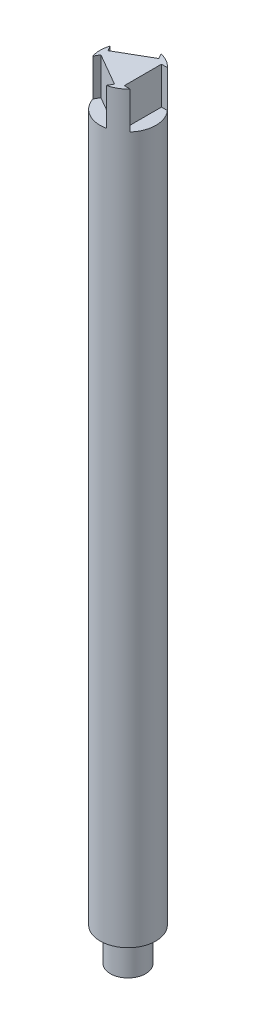
ISO-10303-21;
HEADER;
FILE_DESCRIPTION(('STEP AP214'),'2;1');
FILE_NAME('part.step','',(''),(''),'','','');
FILE_SCHEMA(('AUTOMOTIVE_DESIGN { 1 0 10303 214 1 1 1 1 }'));
ENDSEC;
DATA;
#1=APPLICATION_CONTEXT('core data for automotive mechanical design processes');
#2=APPLICATION_PROTOCOL_DEFINITION('international standard','automotive_design',2000,#1);
#3=PRODUCT_CONTEXT('',#1,'mechanical');
#4=PRODUCT('Part','Part','',(#3));
#5=PRODUCT_RELATED_PRODUCT_CATEGORY('part','',(#4));
#6=PRODUCT_DEFINITION_FORMATION('','',#4);
#7=PRODUCT_DEFINITION_CONTEXT('part definition',#1,'design');
#8=PRODUCT_DEFINITION('design','',#6,#7);
#9=PRODUCT_DEFINITION_SHAPE('','',#8);
#10=(LENGTH_UNIT() NAMED_UNIT(*) SI_UNIT(.MILLI.,.METRE.));
#11=(NAMED_UNIT(*) PLANE_ANGLE_UNIT() SI_UNIT($,.RADIAN.));
#12=(NAMED_UNIT(*) SI_UNIT($,.STERADIAN.) SOLID_ANGLE_UNIT());
#13=UNCERTAINTY_MEASURE_WITH_UNIT(LENGTH_MEASURE(1.E-05),#10,'distance_accuracy_value','');
#14=(GEOMETRIC_REPRESENTATION_CONTEXT(3) GLOBAL_UNCERTAINTY_ASSIGNED_CONTEXT((#13)) GLOBAL_UNIT_ASSIGNED_CONTEXT((#10,
#11,#12)) REPRESENTATION_CONTEXT('',''));
#15=CARTESIAN_POINT('',(0.,0.,0.));
#16=DIRECTION('',(0.,0.,1.));
#17=DIRECTION('',(1.,0.,0.));
#18=AXIS2_PLACEMENT_3D('',#15,#16,#17);
#19=CARTESIAN_POINT('',(0.,209.,0.));
#20=DIRECTION('',(0.,-1.,0.));
#21=DIRECTION('',(0.,0.,-1.));
#22=AXIS2_PLACEMENT_3D('',#19,#20,#21);
#23=CYLINDRICAL_SURFACE('',#22,7.5);
#24=CARTESIAN_POINT('',(0.,9.,0.));
#25=DIRECTION('',(0.,1.,0.));
#26=DIRECTION('',(0.,0.,1.));
#27=AXIS2_PLACEMENT_3D('',#24,#25,#26);
#28=CIRCLE('',#27,7.5);
#29=CARTESIAN_POINT('',(0.,9.,7.5));
#30=VERTEX_POINT('',#29);
#31=EDGE_CURVE('E204',#30,#30,#28,.T.);
#32=ORIENTED_EDGE('',*,*,#31,.T.);
#33=EDGE_LOOP('',(#32));
#34=FACE_BOUND('',#33,.T.);
#35=DIRECTION('',(0.,-1.,0.));
#36=VECTOR('',#35,1.);
#37=CARTESIAN_POINT('',(1.53504204704742,209.,7.34122918275928));
#38=LINE('',#37,#36);
#39=CARTESIAN_POINT('',(1.53504204704742,199.,7.34122918275928));
#40=VERTEX_POINT('',#39);
#41=CARTESIAN_POINT('',(1.53504204704742,209.,7.34122918275928));
#42=VERTEX_POINT('',#41);
#43=EDGE_CURVE('E179',#40,#42,#38,.F.);
#44=ORIENTED_EDGE('',*,*,#43,.F.);
#45=CARTESIAN_POINT('',(0.,199.,0.));
#46=DIRECTION('',(0.,1.,0.));
#47=DIRECTION('',(0.,0.,1.));
#48=AXIS2_PLACEMENT_3D('',#45,#46,#47);
#49=CIRCLE('',#48,7.5);
#50=CARTESIAN_POINT('',(-7.12521199079694,199.,2.34122918275924));
#51=VERTEX_POINT('',#50);
#52=EDGE_CURVE('E11',#51,#40,#49,.T.);
#53=ORIENTED_EDGE('',*,*,#52,.F.);
#54=DIRECTION('',(0.,-1.,0.));
#55=VECTOR('',#54,1.);
#56=CARTESIAN_POINT('',(-7.12521199079694,209.,2.34122918275924));
#57=LINE('',#56,#55);
#58=CARTESIAN_POINT('',(-7.12521199079694,209.,2.34122918275924));
#59=VERTEX_POINT('',#58);
#60=EDGE_CURVE('E176',#59,#51,#57,.T.);
#61=ORIENTED_EDGE('',*,*,#60,.F.);
#62=CARTESIAN_POINT('',(0.,209.,0.));
#63=DIRECTION('',(0.,1.,0.));
#64=DIRECTION('',(0.,0.,1.));
#65=AXIS2_PLACEMENT_3D('',#62,#63,#64);
#66=CIRCLE('',#65,7.5);
#67=CARTESIAN_POINT('',(-7.12521199079691,209.,-2.34122918275934));
#68=VERTEX_POINT('',#67);
#69=EDGE_CURVE('E151',#68,#59,#66,.T.);
#70=ORIENTED_EDGE('',*,*,#69,.F.);
#71=DIRECTION('',(0.,-1.,0.));
#72=VECTOR('',#71,1.);
#73=CARTESIAN_POINT('',(-7.12521199079691,209.,-2.34122918275934));
#74=LINE('',#73,#72);
#75=CARTESIAN_POINT('',(-7.12521199079691,199.,-2.34122918275934));
#76=VERTEX_POINT('',#75);
#77=EDGE_CURVE('E172',#76,#68,#74,.F.);
#78=ORIENTED_EDGE('',*,*,#77,.F.);
#79=CARTESIAN_POINT('',(0.,199.,0.));
#80=DIRECTION('',(0.,1.,0.));
#81=DIRECTION('',(0.,0.,1.));
#82=AXIS2_PLACEMENT_3D('',#79,#80,#81);
#83=CIRCLE('',#82,7.5);
#84=CARTESIAN_POINT('',(1.53504204704752,199.,-7.34122918275926));
#85=VERTEX_POINT('',#84);
#86=EDGE_CURVE('E49',#85,#76,#83,.T.);
#87=ORIENTED_EDGE('',*,*,#86,.F.);
#88=DIRECTION('',(0.,-1.,0.));
#89=VECTOR('',#88,1.);
#90=CARTESIAN_POINT('',(1.53504204704752,209.,-7.34122918275926));
#91=LINE('',#90,#89);
#92=CARTESIAN_POINT('',(1.53504204704752,209.,-7.34122918275926));
#93=VERTEX_POINT('',#92);
#94=EDGE_CURVE('E177',#93,#85,#91,.T.);
#95=ORIENTED_EDGE('',*,*,#94,.F.);
#96=CARTESIAN_POINT('',(5.59016994374948,209.,-5.));
#97=VERTEX_POINT('',#96);
#98=EDGE_CURVE('E205',#97,#93,#66,.T.);
#99=ORIENTED_EDGE('',*,*,#98,.F.);
#100=DIRECTION('',(0.,-1.,0.));
#101=VECTOR('',#100,1.);
#102=CARTESIAN_POINT('',(5.59016994374947,209.,-5.));
#103=LINE('',#102,#101);
#104=CARTESIAN_POINT('',(5.59016994374947,199.,-5.));
#105=VERTEX_POINT('',#104);
#106=EDGE_CURVE('E202',#105,#97,#103,.F.);
#107=ORIENTED_EDGE('',*,*,#106,.F.);
#108=CARTESIAN_POINT('',(0.,199.,0.));
#109=DIRECTION('',(0.,1.,0.));
#110=DIRECTION('',(0.,0.,1.));
#111=AXIS2_PLACEMENT_3D('',#108,#109,#110);
#112=CIRCLE('',#111,7.5);
#113=CARTESIAN_POINT('',(5.59016994374947,199.,5.));
#114=VERTEX_POINT('',#113);
#115=EDGE_CURVE('E223',#114,#105,#112,.T.);
#116=ORIENTED_EDGE('',*,*,#115,.F.);
#117=DIRECTION('',(0.,-1.,0.));
#118=VECTOR('',#117,1.);
#119=CARTESIAN_POINT('',(5.59016994374947,209.,5.));
#120=LINE('',#119,#118);
#121=CARTESIAN_POINT('',(5.59016994374948,209.,5.));
#122=VERTEX_POINT('',#121);
#123=EDGE_CURVE('E199',#122,#114,#120,.T.);
#124=ORIENTED_EDGE('',*,*,#123,.F.);
#125=EDGE_CURVE('E209',#42,#122,#66,.T.);
#126=ORIENTED_EDGE('',*,*,#125,.F.);
#127=EDGE_LOOP('',(#44,#53,#61,#70,#78,#87,#95,#99,#107,#116,#124,#126));
#128=FACE_BOUND('',#127,.T.);
#129=ADVANCED_FACE('F41',(#34,#128),#23,.T.);
#130=CARTESIAN_POINT('',(0.,209.,0.));
#131=DIRECTION('',(0.,1.,0.));
#132=DIRECTION('',(0.,0.,1.));
#133=AXIS2_PLACEMENT_3D('',#130,#131,#132);
#134=PLANE('',#133);
#135=DIRECTION('',(-0.866025403784436,0.,-0.500000000000004));
#136=VECTOR('',#135,1.);
#137=CARTESIAN_POINT('',(-6.3301270189222,209.,0.964101615137725));
#138=LINE('',#137,#136);
#139=CARTESIAN_POINT('',(2.33012701892217,209.,5.96410161513777));
#140=VERTEX_POINT('',#139);
#141=CARTESIAN_POINT('',(-6.3301270189222,209.,0.964101615137725));
#142=VERTEX_POINT('',#141);
#143=EDGE_CURVE('E130',#140,#142,#138,.T.);
#144=ORIENTED_EDGE('',*,*,#143,.F.);
#145=DIRECTION('',(-0.500000000000004,0.,0.866025403784436));
#146=VECTOR('',#145,1.);
#147=CARTESIAN_POINT('',(4.33012701892218,209.,2.50000000000002));
#148=LINE('',#147,#146);
#149=EDGE_CURVE('E152',#140,#42,#148,.T.);
#150=ORIENTED_EDGE('',*,*,#149,.T.);
#151=ORIENTED_EDGE('',*,*,#125,.T.);
#152=DIRECTION('',(-1.,0.,0.));
#153=VECTOR('',#152,1.);
#154=CARTESIAN_POINT('',(0.,209.,5.));
#155=LINE('',#154,#153);
#156=CARTESIAN_POINT('',(4.,209.,5.));
#157=VERTEX_POINT('',#156);
#158=EDGE_CURVE('E215',#122,#157,#155,.T.);
#159=ORIENTED_EDGE('',*,*,#158,.T.);
#160=DIRECTION('',(0.,0.,1.));
#161=VECTOR('',#160,1.);
#162=CARTESIAN_POINT('',(4.,209.,5.));
#163=LINE('',#162,#161);
#164=CARTESIAN_POINT('',(4.,209.,-5.));
#165=VERTEX_POINT('',#164);
#166=EDGE_CURVE('E187',#165,#157,#163,.T.);
#167=ORIENTED_EDGE('',*,*,#166,.F.);
#168=DIRECTION('',(1.,0.,0.));
#169=VECTOR('',#168,1.);
#170=CARTESIAN_POINT('',(0.,209.,-5.));
#171=LINE('',#170,#169);
#172=EDGE_CURVE('E220',#165,#97,#171,.T.);
#173=ORIENTED_EDGE('',*,*,#172,.T.);
#174=ORIENTED_EDGE('',*,*,#98,.T.);
#175=DIRECTION('',(0.499999999999992,0.,0.866025403784443));
#176=VECTOR('',#175,1.);
#177=CARTESIAN_POINT('',(4.33012701892222,209.,-2.49999999999996));
#178=LINE('',#177,#176);
#179=CARTESIAN_POINT('',(2.33012701892225,209.,-5.96410161513773));
#180=VERTEX_POINT('',#179);
#181=EDGE_CURVE('E156',#93,#180,#178,.T.);
#182=ORIENTED_EDGE('',*,*,#181,.T.);
#183=DIRECTION('',(0.866025403784443,0.,-0.499999999999992));
#184=VECTOR('',#183,1.);
#185=CARTESIAN_POINT('',(2.33012701892225,209.,-5.96410161513773));
#186=LINE('',#185,#184);
#187=CARTESIAN_POINT('',(-6.33012701892218,209.,-0.964101615137813));
#188=VERTEX_POINT('',#187);
#189=EDGE_CURVE('E226',#188,#180,#186,.T.);
#190=ORIENTED_EDGE('',*,*,#189,.F.);
#191=DIRECTION('',(-0.499999999999992,0.,-0.866025403784443));
#192=VECTOR('',#191,1.);
#193=CARTESIAN_POINT('',(-4.33012701892222,209.,2.49999999999996));
#194=LINE('',#193,#192);
#195=EDGE_CURVE('E153',#188,#68,#194,.T.);
#196=ORIENTED_EDGE('',*,*,#195,.T.);
#197=ORIENTED_EDGE('',*,*,#69,.T.);
#198=DIRECTION('',(0.500000000000004,0.,-0.866025403784436));
#199=VECTOR('',#198,1.);
#200=CARTESIAN_POINT('',(-4.33012701892218,209.,-2.50000000000002));
#201=LINE('',#200,#199);
#202=EDGE_CURVE('E141',#59,#142,#201,.T.);
#203=ORIENTED_EDGE('',*,*,#202,.T.);
#204=EDGE_LOOP('',(#144,#150,#151,#159,#167,#173,#174,#182,#190,#196,#197,#203));
#205=FACE_BOUND('',#204,.T.);
#206=ADVANCED_FACE('F148',(#205),#134,.T.);
#207=CARTESIAN_POINT('',(0.,9.,0.));
#208=DIRECTION('',(0.,-1.,0.));
#209=DIRECTION('',(0.,0.,-1.));
#210=AXIS2_PLACEMENT_3D('',#207,#208,#209);
#211=CYLINDRICAL_SURFACE('',#210,4.75);
#212=CARTESIAN_POINT('',(0.,9.,0.));
#213=DIRECTION('',(0.,1.,0.));
#214=DIRECTION('',(0.,0.,1.));
#215=AXIS2_PLACEMENT_3D('',#212,#213,#214);
#216=CIRCLE('',#215,4.75);
#217=CARTESIAN_POINT('',(0.,9.,4.75));
#218=VERTEX_POINT('',#217);
#219=EDGE_CURVE('E212',#218,#218,#216,.T.);
#220=ORIENTED_EDGE('',*,*,#219,.F.);
#221=EDGE_LOOP('',(#220));
#222=FACE_BOUND('',#221,.T.);
#223=CARTESIAN_POINT('',(0.,0.,0.));
#224=DIRECTION('',(0.,1.,0.));
#225=DIRECTION('',(0.,0.,1.));
#226=AXIS2_PLACEMENT_3D('',#223,#224,#225);
#227=CIRCLE('',#226,4.75);
#228=CARTESIAN_POINT('',(0.,0.,4.75));
#229=VERTEX_POINT('',#228);
#230=EDGE_CURVE('E208',#229,#229,#227,.T.);
#231=ORIENTED_EDGE('',*,*,#230,.T.);
#232=EDGE_LOOP('',(#231));
#233=FACE_BOUND('',#232,.T.);
#234=ADVANCED_FACE('F43',(#222,#233),#211,.T.);
#235=CARTESIAN_POINT('',(0.,0.,0.));
#236=DIRECTION('',(0.,1.,0.));
#237=DIRECTION('',(0.,0.,1.));
#238=AXIS2_PLACEMENT_3D('',#235,#236,#237);
#239=PLANE('',#238);
#240=ORIENTED_EDGE('',*,*,#230,.F.);
#241=EDGE_LOOP('',(#240));
#242=FACE_BOUND('',#241,.T.);
#243=ADVANCED_FACE('F259',(#242),#239,.F.);
#244=CARTESIAN_POINT('',(0.,9.,0.));
#245=DIRECTION('',(0.,1.,0.));
#246=DIRECTION('',(0.,0.,1.));
#247=AXIS2_PLACEMENT_3D('',#244,#245,#246);
#248=PLANE('',#247);
#249=ORIENTED_EDGE('',*,*,#219,.T.);
#250=EDGE_LOOP('',(#249));
#251=FACE_BOUND('',#250,.T.);
#252=ORIENTED_EDGE('',*,*,#31,.F.);
#253=EDGE_LOOP('',(#252));
#254=FACE_BOUND('',#253,.T.);
#255=ADVANCED_FACE('F252',(#251,#254),#248,.F.);
#256=CARTESIAN_POINT('',(7.5,199.,5.));
#257=DIRECTION('',(0.,1.,0.));
#258=DIRECTION('',(0.,0.,1.));
#259=AXIS2_PLACEMENT_3D('',#256,#257,#258);
#260=PLANE('',#259);
#261=DIRECTION('',(-1.,0.,0.));
#262=VECTOR('',#261,1.);
#263=CARTESIAN_POINT('',(7.5,199.,5.));
#264=LINE('',#263,#262);
#265=CARTESIAN_POINT('',(4.,199.,5.));
#266=VERTEX_POINT('',#265);
#267=EDGE_CURVE('E197',#114,#266,#264,.T.);
#268=ORIENTED_EDGE('',*,*,#267,.F.);
#269=ORIENTED_EDGE('',*,*,#115,.T.);
#270=DIRECTION('',(-1.,0.,0.));
#271=VECTOR('',#270,1.);
#272=CARTESIAN_POINT('',(7.5,199.,-5.));
#273=LINE('',#272,#271);
#274=CARTESIAN_POINT('',(4.,199.,-5.));
#275=VERTEX_POINT('',#274);
#276=EDGE_CURVE('E195',#105,#275,#273,.T.);
#277=ORIENTED_EDGE('',*,*,#276,.T.);
#278=DIRECTION('',(0.,0.,-1.));
#279=VECTOR('',#278,1.);
#280=CARTESIAN_POINT('',(4.,199.,5.));
#281=LINE('',#280,#279);
#282=EDGE_CURVE('E192',#266,#275,#281,.T.);
#283=ORIENTED_EDGE('',*,*,#282,.F.);
#284=EDGE_LOOP('',(#268,#269,#277,#283));
#285=FACE_BOUND('',#284,.T.);
#286=ADVANCED_FACE('F250',(#285),#260,.T.);
#287=CARTESIAN_POINT('',(7.5,199.,-5.));
#288=DIRECTION('',(0.,0.,1.));
#289=DIRECTION('',(1.,0.,0.));
#290=AXIS2_PLACEMENT_3D('',#287,#288,#289);
#291=PLANE('',#290);
#292=ORIENTED_EDGE('',*,*,#106,.T.);
#293=ORIENTED_EDGE('',*,*,#172,.F.);
#294=DIRECTION('',(0.,1.,0.));
#295=VECTOR('',#294,1.);
#296=CARTESIAN_POINT('',(4.,199.,-5.));
#297=LINE('',#296,#295);
#298=EDGE_CURVE('E185',#275,#165,#297,.T.);
#299=ORIENTED_EDGE('',*,*,#298,.F.);
#300=ORIENTED_EDGE('',*,*,#276,.F.);
#301=EDGE_LOOP('',(#292,#293,#299,#300));
#302=FACE_BOUND('',#301,.T.);
#303=ADVANCED_FACE('F238',(#302),#291,.T.);
#304=CARTESIAN_POINT('',(7.5,199.,5.));
#305=DIRECTION('',(0.,0.,-1.));
#306=DIRECTION('',(-1.,0.,0.));
#307=AXIS2_PLACEMENT_3D('',#304,#305,#306);
#308=PLANE('',#307);
#309=ORIENTED_EDGE('',*,*,#123,.T.);
#310=ORIENTED_EDGE('',*,*,#267,.T.);
#311=DIRECTION('',(0.,-1.,0.));
#312=VECTOR('',#311,1.);
#313=CARTESIAN_POINT('',(4.,199.,5.));
#314=LINE('',#313,#312);
#315=EDGE_CURVE('E189',#157,#266,#314,.T.);
#316=ORIENTED_EDGE('',*,*,#315,.F.);
#317=ORIENTED_EDGE('',*,*,#158,.F.);
#318=EDGE_LOOP('',(#309,#310,#316,#317));
#319=FACE_BOUND('',#318,.T.);
#320=ADVANCED_FACE('F247',(#319),#308,.T.);
#321=CARTESIAN_POINT('',(4.,0.,0.));
#322=DIRECTION('',(-1.,0.,0.));
#323=DIRECTION('',(0.,0.,1.));
#324=AXIS2_PLACEMENT_3D('',#321,#322,#323);
#325=PLANE('',#324);
#326=ORIENTED_EDGE('',*,*,#298,.T.);
#327=ORIENTED_EDGE('',*,*,#166,.T.);
#328=ORIENTED_EDGE('',*,*,#315,.T.);
#329=ORIENTED_EDGE('',*,*,#282,.T.);
#330=EDGE_LOOP('',(#326,#327,#328,#329));
#331=FACE_BOUND('',#330,.T.);
#332=ADVANCED_FACE('F244',(#331),#325,.F.);
#333=CARTESIAN_POINT('',(-0.792468245269333,199.,-11.3725952641916));
#334=DIRECTION('',(0.,1.,0.));
#335=DIRECTION('',(0.,0.,1.));
#336=AXIS2_PLACEMENT_3D('',#333,#334,#335);
#337=PLANE('',#336);
#338=ORIENTED_EDGE('',*,*,#86,.T.);
#339=DIRECTION('',(0.499999999999992,0.,0.866025403784443));
#340=VECTOR('',#339,1.);
#341=CARTESIAN_POINT('',(-9.45272228311377,199.,-6.37259526419171));
#342=LINE('',#341,#340);
#343=CARTESIAN_POINT('',(-6.33012701892218,199.,-0.964101615137813));
#344=VERTEX_POINT('',#343);
#345=EDGE_CURVE('E165',#76,#344,#342,.T.);
#346=ORIENTED_EDGE('',*,*,#345,.T.);
#347=DIRECTION('',(-0.866025403784443,0.,0.499999999999992));
#348=VECTOR('',#347,1.);
#349=CARTESIAN_POINT('',(2.33012701892225,199.,-5.96410161513773));
#350=LINE('',#349,#348);
#351=CARTESIAN_POINT('',(2.33012701892225,199.,-5.96410161513773));
#352=VERTEX_POINT('',#351);
#353=EDGE_CURVE('E173',#352,#344,#350,.T.);
#354=ORIENTED_EDGE('',*,*,#353,.F.);
#355=DIRECTION('',(0.499999999999992,0.,0.866025403784443));
#356=VECTOR('',#355,1.);
#357=CARTESIAN_POINT('',(-0.792468245269333,199.,-11.3725952641916));
#358=LINE('',#357,#356);
#359=EDGE_CURVE('E166',#85,#352,#358,.T.);
#360=ORIENTED_EDGE('',*,*,#359,.F.);
#361=EDGE_LOOP('',(#338,#346,#354,#360));
#362=FACE_BOUND('',#361,.T.);
#363=ADVANCED_FACE('F163',(#362),#337,.T.);
#364=CARTESIAN_POINT('',(-9.45272228311377,199.,-6.37259526419171));
#365=DIRECTION('',(0.866025403784443,0.,-0.499999999999992));
#366=DIRECTION('',(-0.499999999999992,0.,-0.866025403784443));
#367=AXIS2_PLACEMENT_3D('',#364,#365,#366);
#368=PLANE('',#367);
#369=ORIENTED_EDGE('',*,*,#77,.T.);
#370=ORIENTED_EDGE('',*,*,#195,.F.);
#371=DIRECTION('',(0.,1.,0.));
#372=VECTOR('',#371,1.);
#373=CARTESIAN_POINT('',(-6.33012701892218,199.,-0.964101615137813));
#374=LINE('',#373,#372);
#375=EDGE_CURVE('E64',#344,#188,#374,.T.);
#376=ORIENTED_EDGE('',*,*,#375,.F.);
#377=ORIENTED_EDGE('',*,*,#345,.F.);
#378=EDGE_LOOP('',(#369,#370,#376,#377));
#379=FACE_BOUND('',#378,.T.);
#380=ADVANCED_FACE('F171',(#379),#368,.T.);
#381=CARTESIAN_POINT('',(-0.792468245269333,199.,-11.3725952641916));
#382=DIRECTION('',(-0.866025403784443,0.,0.499999999999992));
#383=DIRECTION('',(0.499999999999992,0.,0.866025403784443));
#384=AXIS2_PLACEMENT_3D('',#381,#382,#383);
#385=PLANE('',#384);
#386=ORIENTED_EDGE('',*,*,#94,.T.);
#387=ORIENTED_EDGE('',*,*,#359,.T.);
#388=DIRECTION('',(0.,-1.,0.));
#389=VECTOR('',#388,1.);
#390=CARTESIAN_POINT('',(2.33012701892225,199.,-5.96410161513773));
#391=LINE('',#390,#389);
#392=EDGE_CURVE('E232',#180,#352,#391,.T.);
#393=ORIENTED_EDGE('',*,*,#392,.F.);
#394=ORIENTED_EDGE('',*,*,#181,.F.);
#395=EDGE_LOOP('',(#386,#387,#393,#394));
#396=FACE_BOUND('',#395,.T.);
#397=ADVANCED_FACE('F230',(#396),#385,.T.);
#398=CARTESIAN_POINT('',(-1.99999999999997,0.,-3.46410161513777));
#399=DIRECTION('',(0.499999999999992,0.,0.866025403784443));
#400=DIRECTION('',(0.866025403784443,0.,-0.499999999999992));
#401=AXIS2_PLACEMENT_3D('',#398,#399,#400);
#402=PLANE('',#401);
#403=ORIENTED_EDGE('',*,*,#375,.T.);
#404=ORIENTED_EDGE('',*,*,#189,.T.);
#405=ORIENTED_EDGE('',*,*,#392,.T.);
#406=ORIENTED_EDGE('',*,*,#353,.T.);
#407=EDGE_LOOP('',(#403,#404,#405,#406));
#408=FACE_BOUND('',#407,.T.);
#409=ADVANCED_FACE('F353',(#408),#402,.F.);
#410=CARTESIAN_POINT('',(-9.45272228311388,199.,6.37259526419161));
#411=DIRECTION('',(0.,1.,0.));
#412=DIRECTION('',(0.,0.,1.));
#413=AXIS2_PLACEMENT_3D('',#410,#411,#412);
#414=PLANE('',#413);
#415=ORIENTED_EDGE('',*,*,#52,.T.);
#416=DIRECTION('',(0.500000000000004,0.,-0.866025403784436));
#417=VECTOR('',#416,1.);
#418=CARTESIAN_POINT('',(-0.792468245269509,199.,11.3725952641917));
#419=LINE('',#418,#417);
#420=CARTESIAN_POINT('',(2.33012701892217,199.,5.96410161513777));
#421=VERTEX_POINT('',#420);
#422=EDGE_CURVE('E401',#40,#421,#419,.T.);
#423=ORIENTED_EDGE('',*,*,#422,.T.);
#424=DIRECTION('',(0.866025403784436,0.,0.500000000000004));
#425=VECTOR('',#424,1.);
#426=CARTESIAN_POINT('',(-6.3301270189222,199.,0.964101615137725));
#427=LINE('',#426,#425);
#428=CARTESIAN_POINT('',(-6.3301270189222,199.,0.964101615137725));
#429=VERTEX_POINT('',#428);
#430=EDGE_CURVE('E145',#429,#421,#427,.T.);
#431=ORIENTED_EDGE('',*,*,#430,.F.);
#432=DIRECTION('',(0.500000000000004,0.,-0.866025403784436));
#433=VECTOR('',#432,1.);
#434=CARTESIAN_POINT('',(-9.45272228311388,199.,6.37259526419161));
#435=LINE('',#434,#433);
#436=EDGE_CURVE('E144',#51,#429,#435,.T.);
#437=ORIENTED_EDGE('',*,*,#436,.F.);
#438=EDGE_LOOP('',(#415,#423,#431,#437));
#439=FACE_BOUND('',#438,.T.);
#440=ADVANCED_FACE('F362',(#439),#414,.T.);
#441=CARTESIAN_POINT('',(-0.792468245269509,199.,11.3725952641917));
#442=DIRECTION('',(-0.866025403784436,0.,-0.500000000000004));
#443=DIRECTION('',(-0.500000000000004,0.,0.866025403784436));
#444=AXIS2_PLACEMENT_3D('',#441,#442,#443);
#445=PLANE('',#444);
#446=ORIENTED_EDGE('',*,*,#43,.T.);
#447=ORIENTED_EDGE('',*,*,#149,.F.);
#448=DIRECTION('',(0.,1.,0.));
#449=VECTOR('',#448,1.);
#450=CARTESIAN_POINT('',(2.33012701892217,199.,5.96410161513777));
#451=LINE('',#450,#449);
#452=EDGE_CURVE('E56',#421,#140,#451,.T.);
#453=ORIENTED_EDGE('',*,*,#452,.F.);
#454=ORIENTED_EDGE('',*,*,#422,.F.);
#455=EDGE_LOOP('',(#446,#447,#453,#454));
#456=FACE_BOUND('',#455,.T.);
#457=ADVANCED_FACE('F371',(#456),#445,.T.);
#458=CARTESIAN_POINT('',(-9.45272228311388,199.,6.37259526419161));
#459=DIRECTION('',(0.866025403784436,0.,0.500000000000004));
#460=DIRECTION('',(0.500000000000004,0.,-0.866025403784436));
#461=AXIS2_PLACEMENT_3D('',#458,#459,#460);
#462=PLANE('',#461);
#463=ORIENTED_EDGE('',*,*,#60,.T.);
#464=ORIENTED_EDGE('',*,*,#436,.T.);
#465=DIRECTION('',(0.,-1.,0.));
#466=VECTOR('',#465,1.);
#467=CARTESIAN_POINT('',(-6.3301270189222,199.,0.964101615137725));
#468=LINE('',#467,#466);
#469=EDGE_CURVE('E133',#142,#429,#468,.T.);
#470=ORIENTED_EDGE('',*,*,#469,.F.);
#471=ORIENTED_EDGE('',*,*,#202,.F.);
#472=EDGE_LOOP('',(#463,#464,#470,#471));
#473=FACE_BOUND('',#472,.T.);
#474=ADVANCED_FACE('F140',(#473),#462,.T.);
#475=CARTESIAN_POINT('',(-2.00000000000002,0.,3.46410161513775));
#476=DIRECTION('',(0.500000000000004,0.,-0.866025403784436));
#477=DIRECTION('',(-0.866025403784436,0.,-0.500000000000004));
#478=AXIS2_PLACEMENT_3D('',#475,#476,#477);
#479=PLANE('',#478);
#480=ORIENTED_EDGE('',*,*,#452,.T.);
#481=ORIENTED_EDGE('',*,*,#143,.T.);
#482=ORIENTED_EDGE('',*,*,#469,.T.);
#483=ORIENTED_EDGE('',*,*,#430,.T.);
#484=EDGE_LOOP('',(#480,#481,#482,#483));
#485=FACE_BOUND('',#484,.T.);
#486=ADVANCED_FACE('F132',(#485),#479,.F.);
#487=CLOSED_SHELL('',(#129,#206,#234,#243,#255,#286,#303,#320,#332,#363,#380,#397,#409,#440,
#457,#474,#486));
#488=MANIFOLD_SOLID_BREP('B2',#487);
#489=ADVANCED_BREP_SHAPE_REPRESENTATION('',(#18,#488),#14);
#490=SHAPE_DEFINITION_REPRESENTATION(#9,#489);
ENDSEC;
END-ISO-10303-21;
